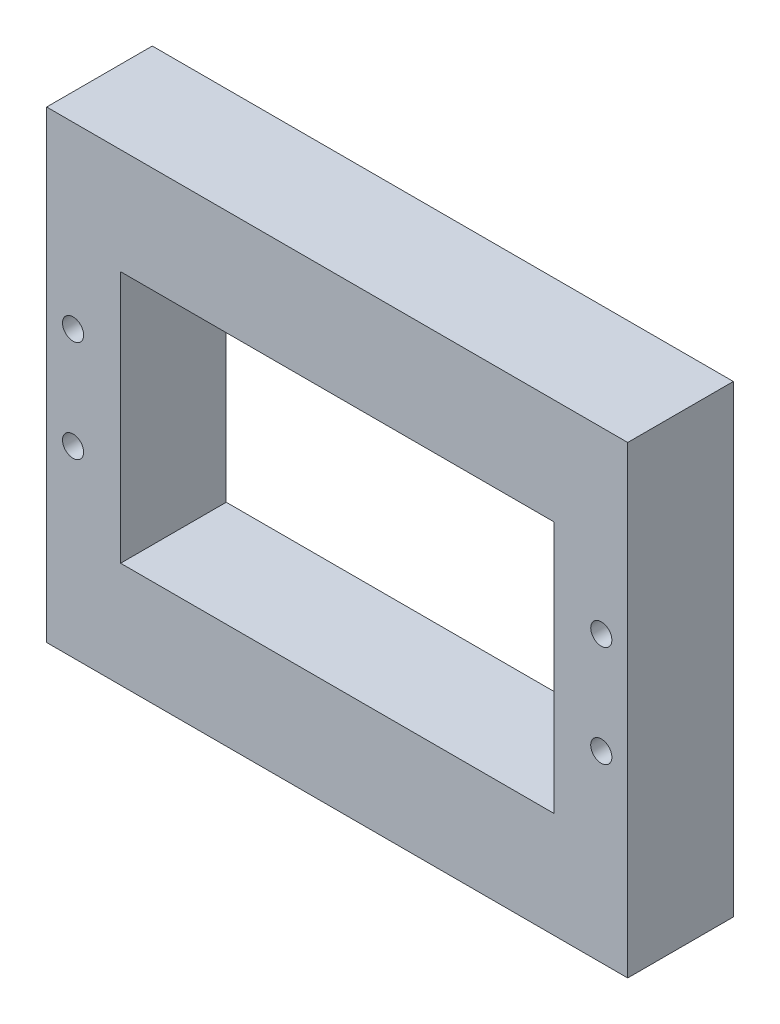
ISO-10303-21;
HEADER;
FILE_DESCRIPTION(('STEP AP214'),'2;1');
FILE_NAME('part.step','',(''),(''),'','','');
FILE_SCHEMA(('AUTOMOTIVE_DESIGN { 1 0 10303 214 1 1 1 1 }'));
ENDSEC;
DATA;
#1=APPLICATION_CONTEXT('core data for automotive mechanical design processes');
#2=APPLICATION_PROTOCOL_DEFINITION('international standard','automotive_design',2000,#1);
#3=PRODUCT_CONTEXT('',#1,'mechanical');
#4=PRODUCT('Part','Part','',(#3));
#5=PRODUCT_RELATED_PRODUCT_CATEGORY('part','',(#4));
#6=PRODUCT_DEFINITION_FORMATION('','',#4);
#7=PRODUCT_DEFINITION_CONTEXT('part definition',#1,'design');
#8=PRODUCT_DEFINITION('design','',#6,#7);
#9=PRODUCT_DEFINITION_SHAPE('','',#8);
#10=(LENGTH_UNIT() NAMED_UNIT(*) SI_UNIT(.MILLI.,.METRE.));
#11=(NAMED_UNIT(*) PLANE_ANGLE_UNIT() SI_UNIT($,.RADIAN.));
#12=(NAMED_UNIT(*) SI_UNIT($,.STERADIAN.) SOLID_ANGLE_UNIT());
#13=UNCERTAINTY_MEASURE_WITH_UNIT(LENGTH_MEASURE(1.E-05),#10,'distance_accuracy_value','');
#14=(GEOMETRIC_REPRESENTATION_CONTEXT(3) GLOBAL_UNCERTAINTY_ASSIGNED_CONTEXT((#13)) GLOBAL_UNIT_ASSIGNED_CONTEXT((#10,
#11,#12)) REPRESENTATION_CONTEXT('',''));
#15=CARTESIAN_POINT('',(0.,0.,0.));
#16=DIRECTION('',(0.,0.,1.));
#17=DIRECTION('',(1.,0.,0.));
#18=AXIS2_PLACEMENT_3D('',#15,#16,#17);
#19=CARTESIAN_POINT('',(0.,1.,0.));
#20=DIRECTION('',(0.,-1.,0.));
#21=DIRECTION('',(0.,0.,-1.));
#22=AXIS2_PLACEMENT_3D('',#19,#20,#21);
#23=PLANE('',#22);
#24=DIRECTION('',(0.,0.,1.));
#25=VECTOR('',#24,1.);
#26=CARTESIAN_POINT('',(48.,1.,-10.));
#27=LINE('',#26,#25);
#28=CARTESIAN_POINT('',(48.,1.,-10.));
#29=VERTEX_POINT('',#28);
#30=CARTESIAN_POINT('',(48.,1.,0.));
#31=VERTEX_POINT('',#30);
#32=EDGE_CURVE('E61',#29,#31,#27,.T.);
#33=ORIENTED_EDGE('',*,*,#32,.F.);
#34=DIRECTION('',(-1.,0.,0.));
#35=VECTOR('',#34,1.);
#36=CARTESIAN_POINT('',(0.,1.,-10.));
#37=LINE('',#36,#35);
#38=CARTESIAN_POINT('',(7.,1.,-9.99999999999999));
#39=VERTEX_POINT('',#38);
#40=EDGE_CURVE('E221',#29,#39,#37,.T.);
#41=ORIENTED_EDGE('',*,*,#40,.T.);
#42=DIRECTION('',(0.,0.,-1.));
#43=VECTOR('',#42,1.);
#44=CARTESIAN_POINT('',(7.,1.,-9.99999999999999));
#45=LINE('',#44,#43);
#46=CARTESIAN_POINT('',(7.,1.,0.));
#47=VERTEX_POINT('',#46);
#48=EDGE_CURVE('E66',#47,#39,#45,.T.);
#49=ORIENTED_EDGE('',*,*,#48,.F.);
#50=DIRECTION('',(1.,0.,0.));
#51=VECTOR('',#50,1.);
#52=CARTESIAN_POINT('',(0.,1.,0.));
#53=LINE('',#52,#51);
#54=EDGE_CURVE('E205',#47,#31,#53,.T.);
#55=ORIENTED_EDGE('',*,*,#54,.T.);
#56=EDGE_LOOP('',(#33,#41,#49,#55));
#57=FACE_BOUND('',#56,.T.);
#58=ADVANCED_FACE('F45',(#57),#23,.F.);
#59=CARTESIAN_POINT('',(0.,1.,0.));
#60=DIRECTION('',(1.,0.,0.));
#61=DIRECTION('',(0.,0.,-1.));
#62=AXIS2_PLACEMENT_3D('',#59,#60,#61);
#63=PLANE('',#62);
#64=DIRECTION('',(0.,-1.,0.));
#65=VECTOR('',#64,1.);
#66=CARTESIAN_POINT('',(0.,1.,-10.));
#67=LINE('',#66,#65);
#68=CARTESIAN_POINT('',(0.,34.9,-9.99999999999999));
#69=VERTEX_POINT('',#68);
#70=CARTESIAN_POINT('',(0.,-9.,-10.));
#71=VERTEX_POINT('',#70);
#72=EDGE_CURVE('E224',#69,#71,#67,.T.);
#73=ORIENTED_EDGE('',*,*,#72,.T.);
#74=DIRECTION('',(0.,0.,-1.));
#75=VECTOR('',#74,1.);
#76=CARTESIAN_POINT('',(0.,-9.,0.));
#77=LINE('',#76,#75);
#78=CARTESIAN_POINT('',(0.,-9.,0.));
#79=VERTEX_POINT('',#78);
#80=EDGE_CURVE('E113',#79,#71,#77,.T.);
#81=ORIENTED_EDGE('',*,*,#80,.F.);
#82=DIRECTION('',(0.,-1.,0.));
#83=VECTOR('',#82,1.);
#84=CARTESIAN_POINT('',(0.,1.,0.));
#85=LINE('',#84,#83);
#86=CARTESIAN_POINT('',(0.,34.9,0.));
#87=VERTEX_POINT('',#86);
#88=EDGE_CURVE('E11',#87,#79,#85,.T.);
#89=ORIENTED_EDGE('',*,*,#88,.F.);
#90=DIRECTION('',(0.,0.,1.));
#91=VECTOR('',#90,1.);
#92=CARTESIAN_POINT('',(0.,34.9,-9.99999999999999));
#93=LINE('',#92,#91);
#94=EDGE_CURVE('E111',#69,#87,#93,.T.);
#95=ORIENTED_EDGE('',*,*,#94,.F.);
#96=EDGE_LOOP('',(#73,#81,#89,#95));
#97=FACE_BOUND('',#96,.T.);
#98=ADVANCED_FACE('F47',(#97),#63,.F.);
#99=CARTESIAN_POINT('',(0.,1.,0.));
#100=DIRECTION('',(0.,0.,-1.));
#101=DIRECTION('',(-1.,0.,0.));
#102=AXIS2_PLACEMENT_3D('',#99,#100,#101);
#103=PLANE('',#102);
#104=DIRECTION('',(0.,-1.,0.));
#105=VECTOR('',#104,1.);
#106=CARTESIAN_POINT('',(7.,24.9,0.));
#107=LINE('',#106,#105);
#108=CARTESIAN_POINT('',(7.,24.9,0.));
#109=VERTEX_POINT('',#108);
#110=EDGE_CURVE('E190',#109,#47,#107,.T.);
#111=ORIENTED_EDGE('',*,*,#110,.F.);
#112=DIRECTION('',(1.,0.,0.));
#113=VECTOR('',#112,1.);
#114=CARTESIAN_POINT('',(0.,24.9,0.));
#115=LINE('',#114,#113);
#116=CARTESIAN_POINT('',(48.,24.9,0.));
#117=VERTEX_POINT('',#116);
#118=EDGE_CURVE('E135',#109,#117,#115,.T.);
#119=ORIENTED_EDGE('',*,*,#118,.T.);
#120=DIRECTION('',(0.,-1.,0.));
#121=VECTOR('',#120,1.);
#122=CARTESIAN_POINT('',(48.,24.9,0.));
#123=LINE('',#122,#121);
#124=EDGE_CURVE('E195',#117,#31,#123,.T.);
#125=ORIENTED_EDGE('',*,*,#124,.T.);
#126=ORIENTED_EDGE('',*,*,#54,.F.);
#127=EDGE_LOOP('',(#111,#119,#125,#126));
#128=FACE_BOUND('',#127,.T.);
#129=CARTESIAN_POINT('',(52.5,17.95,0.));
#130=DIRECTION('',(0.,0.,1.));
#131=DIRECTION('',(-1.,0.,0.));
#132=AXIS2_PLACEMENT_3D('',#129,#130,#131);
#133=CIRCLE('',#132,1.00000000000001);
#134=CARTESIAN_POINT('',(51.5,17.95,0.));
#135=VERTEX_POINT('',#134);
#136=EDGE_CURVE('E173',#135,#135,#133,.T.);
#137=ORIENTED_EDGE('',*,*,#136,.F.);
#138=EDGE_LOOP('',(#137));
#139=FACE_BOUND('',#138,.T.);
#140=CARTESIAN_POINT('',(52.5,8.35,0.));
#141=DIRECTION('',(0.,0.,1.));
#142=DIRECTION('',(1.,0.,0.));
#143=AXIS2_PLACEMENT_3D('',#140,#141,#142);
#144=CIRCLE('',#143,0.999999999999998);
#145=CARTESIAN_POINT('',(53.5,8.35,0.));
#146=VERTEX_POINT('',#145);
#147=EDGE_CURVE('E164',#146,#146,#144,.T.);
#148=ORIENTED_EDGE('',*,*,#147,.F.);
#149=EDGE_LOOP('',(#148));
#150=FACE_BOUND('',#149,.T.);
#151=CARTESIAN_POINT('',(2.5,8.35,0.));
#152=DIRECTION('',(0.,0.,1.));
#153=DIRECTION('',(-1.,0.,0.));
#154=AXIS2_PLACEMENT_3D('',#151,#152,#153);
#155=CIRCLE('',#154,1.);
#156=CARTESIAN_POINT('',(1.5,8.35,0.));
#157=VERTEX_POINT('',#156);
#158=EDGE_CURVE('E163',#157,#157,#155,.T.);
#159=ORIENTED_EDGE('',*,*,#158,.F.);
#160=EDGE_LOOP('',(#159));
#161=FACE_BOUND('',#160,.T.);
#162=CARTESIAN_POINT('',(2.5,17.95,0.));
#163=DIRECTION('',(0.,0.,1.));
#164=DIRECTION('',(1.,0.,0.));
#165=AXIS2_PLACEMENT_3D('',#162,#163,#164);
#166=CIRCLE('',#165,1.);
#167=CARTESIAN_POINT('',(3.5,17.95,0.));
#168=VERTEX_POINT('',#167);
#169=EDGE_CURVE('E168',#168,#168,#166,.T.);
#170=ORIENTED_EDGE('',*,*,#169,.F.);
#171=EDGE_LOOP('',(#170));
#172=FACE_BOUND('',#171,.T.);
#173=ORIENTED_EDGE('',*,*,#88,.T.);
#174=DIRECTION('',(-1.,0.,0.));
#175=VECTOR('',#174,1.);
#176=CARTESIAN_POINT('',(0.,-9.,0.));
#177=LINE('',#176,#175);
#178=CARTESIAN_POINT('',(55.,-9.,0.));
#179=VERTEX_POINT('',#178);
#180=EDGE_CURVE('E155',#179,#79,#177,.T.);
#181=ORIENTED_EDGE('',*,*,#180,.F.);
#182=DIRECTION('',(0.,-1.,0.));
#183=VECTOR('',#182,1.);
#184=CARTESIAN_POINT('',(55.,1.,0.));
#185=LINE('',#184,#183);
#186=CARTESIAN_POINT('',(55.,34.9,0.));
#187=VERTEX_POINT('',#186);
#188=EDGE_CURVE('E54',#187,#179,#185,.T.);
#189=ORIENTED_EDGE('',*,*,#188,.F.);
#190=DIRECTION('',(1.,0.,0.));
#191=VECTOR('',#190,1.);
#192=CARTESIAN_POINT('',(0.,34.9,0.));
#193=LINE('',#192,#191);
#194=EDGE_CURVE('E118',#87,#187,#193,.T.);
#195=ORIENTED_EDGE('',*,*,#194,.F.);
#196=EDGE_LOOP('',(#173,#181,#189,#195));
#197=FACE_BOUND('',#196,.T.);
#198=ADVANCED_FACE('F119',(#128,#139,#150,#161,#172,#197),#103,.F.);
#199=CARTESIAN_POINT('',(55.,1.,0.));
#200=DIRECTION('',(-1.,0.,0.));
#201=DIRECTION('',(0.,0.,1.));
#202=AXIS2_PLACEMENT_3D('',#199,#200,#201);
#203=PLANE('',#202);
#204=ORIENTED_EDGE('',*,*,#188,.T.);
#205=DIRECTION('',(0.,0.,1.));
#206=VECTOR('',#205,1.);
#207=CARTESIAN_POINT('',(55.,-9.,0.));
#208=LINE('',#207,#206);
#209=CARTESIAN_POINT('',(55.,-9.,-10.));
#210=VERTEX_POINT('',#209);
#211=EDGE_CURVE('E151',#210,#179,#208,.T.);
#212=ORIENTED_EDGE('',*,*,#211,.F.);
#213=DIRECTION('',(0.,-1.,0.));
#214=VECTOR('',#213,1.);
#215=CARTESIAN_POINT('',(55.,1.,-10.));
#216=LINE('',#215,#214);
#217=CARTESIAN_POINT('',(55.,34.9,-9.99999999999999));
#218=VERTEX_POINT('',#217);
#219=EDGE_CURVE('E227',#218,#210,#216,.T.);
#220=ORIENTED_EDGE('',*,*,#219,.F.);
#221=DIRECTION('',(0.,0.,-1.));
#222=VECTOR('',#221,1.);
#223=CARTESIAN_POINT('',(55.,34.9,-9.99999999999999));
#224=LINE('',#223,#222);
#225=EDGE_CURVE('E124',#187,#218,#224,.T.);
#226=ORIENTED_EDGE('',*,*,#225,.F.);
#227=EDGE_LOOP('',(#204,#212,#220,#226));
#228=FACE_BOUND('',#227,.T.);
#229=ADVANCED_FACE('F232',(#228),#203,.F.);
#230=CARTESIAN_POINT('',(0.,1.,-10.));
#231=DIRECTION('',(0.,0.,1.));
#232=DIRECTION('',(1.,0.,0.));
#233=AXIS2_PLACEMENT_3D('',#230,#231,#232);
#234=PLANE('',#233);
#235=ORIENTED_EDGE('',*,*,#72,.F.);
#236=DIRECTION('',(-1.,0.,0.));
#237=VECTOR('',#236,1.);
#238=CARTESIAN_POINT('',(0.,34.9,-9.99999999999999));
#239=LINE('',#238,#237);
#240=EDGE_CURVE('E129',#218,#69,#239,.T.);
#241=ORIENTED_EDGE('',*,*,#240,.F.);
#242=ORIENTED_EDGE('',*,*,#219,.T.);
#243=DIRECTION('',(1.,0.,0.));
#244=VECTOR('',#243,1.);
#245=CARTESIAN_POINT('',(0.,-9.,-10.));
#246=LINE('',#245,#244);
#247=EDGE_CURVE('E147',#71,#210,#246,.T.);
#248=ORIENTED_EDGE('',*,*,#247,.F.);
#249=EDGE_LOOP('',(#235,#241,#242,#248));
#250=FACE_BOUND('',#249,.T.);
#251=CARTESIAN_POINT('',(52.5,17.95,-10.));
#252=DIRECTION('',(0.,0.,1.));
#253=DIRECTION('',(1.,0.,0.));
#254=AXIS2_PLACEMENT_3D('',#251,#252,#253);
#255=CIRCLE('',#254,1.00000000000001);
#256=CARTESIAN_POINT('',(53.5,17.95,-10.));
#257=VERTEX_POINT('',#256);
#258=EDGE_CURVE('E158',#257,#257,#255,.F.);
#259=ORIENTED_EDGE('',*,*,#258,.F.);
#260=EDGE_LOOP('',(#259));
#261=FACE_BOUND('',#260,.T.);
#262=CARTESIAN_POINT('',(52.5,8.35,-10.));
#263=DIRECTION('',(0.,0.,1.));
#264=DIRECTION('',(1.,0.,0.));
#265=AXIS2_PLACEMENT_3D('',#262,#263,#264);
#266=CIRCLE('',#265,0.999999999999998);
#267=CARTESIAN_POINT('',(53.5,8.35,-10.));
#268=VERTEX_POINT('',#267);
#269=EDGE_CURVE('E169',#268,#268,#266,.F.);
#270=ORIENTED_EDGE('',*,*,#269,.F.);
#271=EDGE_LOOP('',(#270));
#272=FACE_BOUND('',#271,.T.);
#273=CARTESIAN_POINT('',(2.5,8.35,-10.));
#274=DIRECTION('',(0.,0.,1.));
#275=DIRECTION('',(1.,0.,0.));
#276=AXIS2_PLACEMENT_3D('',#273,#274,#275);
#277=CIRCLE('',#276,1.);
#278=CARTESIAN_POINT('',(3.5,8.35,-10.));
#279=VERTEX_POINT('',#278);
#280=EDGE_CURVE('E159',#279,#279,#277,.F.);
#281=ORIENTED_EDGE('',*,*,#280,.F.);
#282=EDGE_LOOP('',(#281));
#283=FACE_BOUND('',#282,.T.);
#284=CARTESIAN_POINT('',(2.5,17.95,-10.));
#285=DIRECTION('',(0.,0.,1.));
#286=DIRECTION('',(1.,0.,0.));
#287=AXIS2_PLACEMENT_3D('',#284,#285,#286);
#288=CIRCLE('',#287,1.);
#289=CARTESIAN_POINT('',(3.5,17.95,-10.));
#290=VERTEX_POINT('',#289);
#291=EDGE_CURVE('E186',#290,#290,#288,.F.);
#292=ORIENTED_EDGE('',*,*,#291,.F.);
#293=EDGE_LOOP('',(#292));
#294=FACE_BOUND('',#293,.T.);
#295=DIRECTION('',(-1.,0.,0.));
#296=VECTOR('',#295,1.);
#297=CARTESIAN_POINT('',(0.,24.9,-9.99999999999999));
#298=LINE('',#297,#296);
#299=CARTESIAN_POINT('',(48.,24.9,-9.99999999999999));
#300=VERTEX_POINT('',#299);
#301=CARTESIAN_POINT('',(7.,24.9,-9.99999999999999));
#302=VERTEX_POINT('',#301);
#303=EDGE_CURVE('E131',#300,#302,#298,.T.);
#304=ORIENTED_EDGE('',*,*,#303,.T.);
#305=DIRECTION('',(0.,-1.,0.));
#306=VECTOR('',#305,1.);
#307=CARTESIAN_POINT('',(7.,24.9,-9.99999999999999));
#308=LINE('',#307,#306);
#309=EDGE_CURVE('E209',#302,#39,#308,.T.);
#310=ORIENTED_EDGE('',*,*,#309,.T.);
#311=ORIENTED_EDGE('',*,*,#40,.F.);
#312=DIRECTION('',(0.,-1.,0.));
#313=VECTOR('',#312,1.);
#314=CARTESIAN_POINT('',(48.,24.9,-10.));
#315=LINE('',#314,#313);
#316=EDGE_CURVE('E201',#300,#29,#315,.T.);
#317=ORIENTED_EDGE('',*,*,#316,.F.);
#318=EDGE_LOOP('',(#304,#310,#311,#317));
#319=FACE_BOUND('',#318,.T.);
#320=ADVANCED_FACE('F237',(#250,#261,#272,#283,#294,#319),#234,.F.);
#321=CARTESIAN_POINT('',(7.,24.9,-9.99999999999999));
#322=DIRECTION('',(-1.,0.,0.));
#323=DIRECTION('',(0.,0.,1.));
#324=AXIS2_PLACEMENT_3D('',#321,#322,#323);
#325=PLANE('',#324);
#326=ORIENTED_EDGE('',*,*,#48,.T.);
#327=ORIENTED_EDGE('',*,*,#309,.F.);
#328=DIRECTION('',(0.,0.,-1.));
#329=VECTOR('',#328,1.);
#330=CARTESIAN_POINT('',(7.,24.9,-9.99999999999999));
#331=LINE('',#330,#329);
#332=EDGE_CURVE('E213',#109,#302,#331,.T.);
#333=ORIENTED_EDGE('',*,*,#332,.F.);
#334=ORIENTED_EDGE('',*,*,#110,.T.);
#335=EDGE_LOOP('',(#326,#327,#333,#334));
#336=FACE_BOUND('',#335,.T.);
#337=ADVANCED_FACE('F240',(#336),#325,.F.);
#338=CARTESIAN_POINT('',(48.,24.9,-10.));
#339=DIRECTION('',(1.,0.,0.));
#340=DIRECTION('',(0.,0.,-1.));
#341=AXIS2_PLACEMENT_3D('',#338,#339,#340);
#342=PLANE('',#341);
#343=ORIENTED_EDGE('',*,*,#32,.T.);
#344=ORIENTED_EDGE('',*,*,#124,.F.);
#345=DIRECTION('',(0.,0.,1.));
#346=VECTOR('',#345,1.);
#347=CARTESIAN_POINT('',(48.,24.9,-10.));
#348=LINE('',#347,#346);
#349=EDGE_CURVE('E191',#300,#117,#348,.T.);
#350=ORIENTED_EDGE('',*,*,#349,.F.);
#351=ORIENTED_EDGE('',*,*,#316,.T.);
#352=EDGE_LOOP('',(#343,#344,#350,#351));
#353=FACE_BOUND('',#352,.T.);
#354=ADVANCED_FACE('F260',(#353),#342,.F.);
#355=CARTESIAN_POINT('',(2.5,17.95,-10.001));
#356=DIRECTION('',(0.,0.,1.));
#357=DIRECTION('',(1.,0.,0.));
#358=AXIS2_PLACEMENT_3D('',#355,#356,#357);
#359=CYLINDRICAL_SURFACE('',#358,1.);
#360=ORIENTED_EDGE('',*,*,#169,.T.);
#361=EDGE_LOOP('',(#360));
#362=FACE_BOUND('',#361,.T.);
#363=ORIENTED_EDGE('',*,*,#291,.T.);
#364=EDGE_LOOP('',(#363));
#365=FACE_BOUND('',#364,.T.);
#366=ADVANCED_FACE('F262',(#362,#365),#359,.F.);
#367=CARTESIAN_POINT('',(2.5,8.35,-10.001));
#368=DIRECTION('',(0.,0.,1.));
#369=DIRECTION('',(1.,0.,0.));
#370=AXIS2_PLACEMENT_3D('',#367,#368,#369);
#371=CYLINDRICAL_SURFACE('',#370,1.);
#372=ORIENTED_EDGE('',*,*,#158,.T.);
#373=EDGE_LOOP('',(#372));
#374=FACE_BOUND('',#373,.T.);
#375=ORIENTED_EDGE('',*,*,#280,.T.);
#376=EDGE_LOOP('',(#375));
#377=FACE_BOUND('',#376,.T.);
#378=ADVANCED_FACE('F269',(#374,#377),#371,.F.);
#379=CARTESIAN_POINT('',(52.5,8.35,-10.001));
#380=DIRECTION('',(0.,0.,1.));
#381=DIRECTION('',(1.,0.,0.));
#382=AXIS2_PLACEMENT_3D('',#379,#380,#381);
#383=CYLINDRICAL_SURFACE('',#382,0.999999999999998);
#384=ORIENTED_EDGE('',*,*,#147,.T.);
#385=EDGE_LOOP('',(#384));
#386=FACE_BOUND('',#385,.T.);
#387=ORIENTED_EDGE('',*,*,#269,.T.);
#388=EDGE_LOOP('',(#387));
#389=FACE_BOUND('',#388,.T.);
#390=ADVANCED_FACE('F327',(#386,#389),#383,.F.);
#391=CARTESIAN_POINT('',(52.5,17.95,-10.001));
#392=DIRECTION('',(0.,0.,1.));
#393=DIRECTION('',(1.,0.,0.));
#394=AXIS2_PLACEMENT_3D('',#391,#392,#393);
#395=CYLINDRICAL_SURFACE('',#394,1.00000000000001);
#396=ORIENTED_EDGE('',*,*,#136,.T.);
#397=EDGE_LOOP('',(#396));
#398=FACE_BOUND('',#397,.T.);
#399=ORIENTED_EDGE('',*,*,#258,.T.);
#400=EDGE_LOOP('',(#399));
#401=FACE_BOUND('',#400,.T.);
#402=ADVANCED_FACE('F337',(#398,#401),#395,.F.);
#403=CARTESIAN_POINT('',(0.,-9.,0.));
#404=DIRECTION('',(0.,-1.,0.));
#405=DIRECTION('',(0.,0.,-1.));
#406=AXIS2_PLACEMENT_3D('',#403,#404,#405);
#407=PLANE('',#406);
#408=ORIENTED_EDGE('',*,*,#80,.T.);
#409=ORIENTED_EDGE('',*,*,#247,.T.);
#410=ORIENTED_EDGE('',*,*,#211,.T.);
#411=ORIENTED_EDGE('',*,*,#180,.T.);
#412=EDGE_LOOP('',(#408,#409,#410,#411));
#413=FACE_BOUND('',#412,.T.);
#414=ADVANCED_FACE('F234',(#413),#407,.T.);
#415=CARTESIAN_POINT('',(0.,24.9,0.));
#416=DIRECTION('',(0.,1.,0.));
#417=DIRECTION('',(0.,0.,1.));
#418=AXIS2_PLACEMENT_3D('',#415,#416,#417);
#419=PLANE('',#418);
#420=ORIENTED_EDGE('',*,*,#118,.F.);
#421=ORIENTED_EDGE('',*,*,#332,.T.);
#422=ORIENTED_EDGE('',*,*,#303,.F.);
#423=ORIENTED_EDGE('',*,*,#349,.T.);
#424=EDGE_LOOP('',(#420,#421,#422,#423));
#425=FACE_BOUND('',#424,.T.);
#426=ADVANCED_FACE('F254',(#425),#419,.F.);
#427=CARTESIAN_POINT('',(0.,34.9,0.));
#428=DIRECTION('',(0.,1.,0.));
#429=DIRECTION('',(0.,0.,1.));
#430=AXIS2_PLACEMENT_3D('',#427,#428,#429);
#431=PLANE('',#430);
#432=ORIENTED_EDGE('',*,*,#94,.T.);
#433=ORIENTED_EDGE('',*,*,#194,.T.);
#434=ORIENTED_EDGE('',*,*,#225,.T.);
#435=ORIENTED_EDGE('',*,*,#240,.T.);
#436=EDGE_LOOP('',(#432,#433,#434,#435));
#437=FACE_BOUND('',#436,.T.);
#438=ADVANCED_FACE('F127',(#437),#431,.T.);
#439=CLOSED_SHELL('',(#58,#98,#198,#229,#320,#337,#354,#366,#378,#390,#402,#414,#426,#438));
#440=MANIFOLD_SOLID_BREP('B2',#439);
#441=ADVANCED_BREP_SHAPE_REPRESENTATION('',(#18,#440),#14);
#442=SHAPE_DEFINITION_REPRESENTATION(#9,#441);
ENDSEC;
END-ISO-10303-21;
